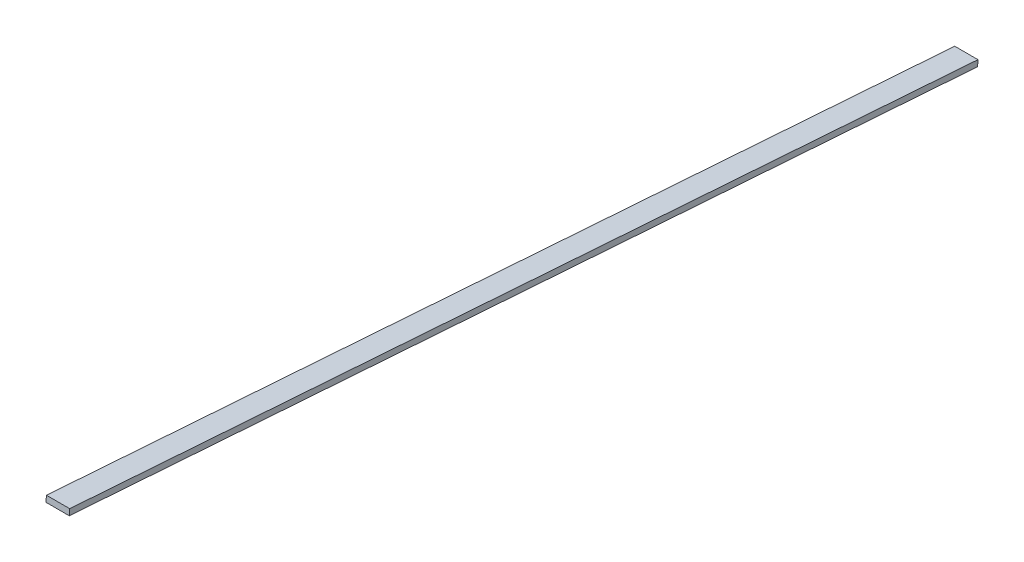
ISO-10303-21;
HEADER;
FILE_DESCRIPTION(('STEP AP214'),'2;1');
FILE_NAME('part.step','',(''),(''),'','','');
FILE_SCHEMA(('AUTOMOTIVE_DESIGN { 1 0 10303 214 1 1 1 1 }'));
ENDSEC;
DATA;
#1=APPLICATION_CONTEXT('core data for automotive mechanical design processes');
#2=APPLICATION_PROTOCOL_DEFINITION('international standard','automotive_design',2000,#1);
#3=PRODUCT_CONTEXT('',#1,'mechanical');
#4=PRODUCT('Part','Part','',(#3));
#5=PRODUCT_RELATED_PRODUCT_CATEGORY('part','',(#4));
#6=PRODUCT_DEFINITION_FORMATION('','',#4);
#7=PRODUCT_DEFINITION_CONTEXT('part definition',#1,'design');
#8=PRODUCT_DEFINITION('design','',#6,#7);
#9=PRODUCT_DEFINITION_SHAPE('','',#8);
#10=(LENGTH_UNIT() NAMED_UNIT(*) SI_UNIT(.MILLI.,.METRE.));
#11=(NAMED_UNIT(*) PLANE_ANGLE_UNIT() SI_UNIT($,.RADIAN.));
#12=(NAMED_UNIT(*) SI_UNIT($,.STERADIAN.) SOLID_ANGLE_UNIT());
#13=UNCERTAINTY_MEASURE_WITH_UNIT(LENGTH_MEASURE(1.E-05),#10,'distance_accuracy_value','');
#14=(GEOMETRIC_REPRESENTATION_CONTEXT(3) GLOBAL_UNCERTAINTY_ASSIGNED_CONTEXT((#13)) GLOBAL_UNIT_ASSIGNED_CONTEXT((#10,
#11,#12)) REPRESENTATION_CONTEXT('',''));
#15=CARTESIAN_POINT('',(0.,0.,0.));
#16=DIRECTION('',(0.,0.,1.));
#17=DIRECTION('',(1.,0.,0.));
#18=AXIS2_PLACEMENT_3D('',#15,#16,#17);
#19=CARTESIAN_POINT('',(238.509206630726,-2.28315338320972E-13,-3.17570620364431E-12));
#20=DIRECTION('',(-1.,0.,0.));
#21=DIRECTION('',(0.,0.,-1.));
#22=AXIS2_PLACEMENT_3D('',#19,#20,#21);
#23=PLANE('',#22);
#24=DIRECTION('',(0.,0.997425576822391,-0.0717092650953869));
#25=VECTOR('',#24,1.);
#26=CARTESIAN_POINT('',(238.509206630716,424.560737078755,-777.222709452929));
#27=LINE('',#26,#25);
#28=CARTESIAN_POINT('',(238.509206630716,419.810497769102,-776.88119407791));
#29=VERTEX_POINT('',#28);
#30=CARTESIAN_POINT('',(238.509206630716,424.560737078755,-777.222709452929));
#31=VERTEX_POINT('',#30);
#32=EDGE_CURVE('E88',#29,#31,#27,.T.);
#33=ORIENTED_EDGE('',*,*,#32,.T.);
#34=DIRECTION('',(0.,-0.0717092650953896,-0.997425576822391));
#35=VECTOR('',#34,1.);
#36=CARTESIAN_POINT('',(238.509206630707,372.516415969676,-1501.12270945293));
#37=LINE('',#36,#35);
#38=CARTESIAN_POINT('',(238.509206630707,372.516415969676,-1501.12270945293));
#39=VERTEX_POINT('',#38);
#40=EDGE_CURVE('E94',#31,#39,#37,.T.);
#41=ORIENTED_EDGE('',*,*,#40,.T.);
#42=DIRECTION('',(0.,-0.997425576822391,0.0717092650953928));
#43=VECTOR('',#42,1.);
#44=CARTESIAN_POINT('',(238.509206630707,367.766176660059,-1500.78119407791));
#45=LINE('',#44,#43);
#46=CARTESIAN_POINT('',(238.509206630707,367.766176660059,-1500.78119407791));
#47=VERTEX_POINT('',#46);
#48=EDGE_CURVE('E90',#39,#47,#45,.T.);
#49=ORIENTED_EDGE('',*,*,#48,.T.);
#50=DIRECTION('',(0.,0.0717092650953895,0.997425576822391));
#51=VECTOR('',#50,1.);
#52=CARTESIAN_POINT('',(238.509206630707,367.994441226327,-1497.60619407791));
#53=LINE('',#52,#51);
#54=EDGE_CURVE('E80',#47,#29,#53,.T.);
#55=ORIENTED_EDGE('',*,*,#54,.T.);
#56=EDGE_LOOP('',(#33,#41,#49,#55));
#57=FACE_BOUND('',#56,.T.);
#58=ADVANCED_FACE('F35',(#57),#23,.T.);
#59=CARTESIAN_POINT('',(983.516205571364,367.994441226327,-1497.60619407792));
#60=DIRECTION('',(0.,0.997425576822391,-0.0717092650953895));
#61=DIRECTION('',(0.,-0.0717092650953895,-0.997425576822391));
#62=AXIS2_PLACEMENT_3D('',#59,#60,#61);
#63=PLANE('',#62);
#64=DIRECTION('',(-1.,0.,0.));
#65=VECTOR('',#64,1.);
#66=CARTESIAN_POINT('',(983.516205571374,419.810497769102,-776.88119407792));
#67=LINE('',#66,#65);
#68=CARTESIAN_POINT('',(257.051206630713,419.810497769138,-776.88119407791));
#69=VERTEX_POINT('',#68);
#70=EDGE_CURVE('E76',#69,#29,#67,.T.);
#71=ORIENTED_EDGE('',*,*,#70,.T.);
#72=ORIENTED_EDGE('',*,*,#54,.F.);
#73=DIRECTION('',(-1.,0.,0.));
#74=VECTOR('',#73,1.);
#75=CARTESIAN_POINT('',(983.516205571364,367.766176660059,-1500.78119407792));
#76=LINE('',#75,#74);
#77=CARTESIAN_POINT('',(257.051206630709,367.766176660059,-1500.78119407791));
#78=VERTEX_POINT('',#77);
#79=EDGE_CURVE('E91',#78,#47,#76,.T.);
#80=ORIENTED_EDGE('',*,*,#79,.F.);
#81=DIRECTION('',(0.,-0.0717092650953895,-0.997425576822391));
#82=VECTOR('',#81,1.);
#83=CARTESIAN_POINT('',(257.051206630704,367.994441226327,-1497.60619407791));
#84=LINE('',#83,#82);
#85=EDGE_CURVE('E39',#69,#78,#84,.T.);
#86=ORIENTED_EDGE('',*,*,#85,.F.);
#87=EDGE_LOOP('',(#71,#72,#80,#86));
#88=FACE_BOUND('',#87,.T.);
#89=ADVANCED_FACE('F78',(#88),#63,.F.);
#90=CARTESIAN_POINT('',(983.516205571364,367.766176660059,-1500.78119407792));
#91=DIRECTION('',(0.,0.0717092650953929,0.997425576822391));
#92=DIRECTION('',(0.,0.997425576822391,-0.0717092650953929));
#93=AXIS2_PLACEMENT_3D('',#90,#91,#92);
#94=PLANE('',#93);
#95=ORIENTED_EDGE('',*,*,#79,.T.);
#96=ORIENTED_EDGE('',*,*,#48,.F.);
#97=DIRECTION('',(-1.,0.,0.));
#98=VECTOR('',#97,1.);
#99=CARTESIAN_POINT('',(983.516205571364,372.516415969676,-1501.12270945294));
#100=LINE('',#99,#98);
#101=CARTESIAN_POINT('',(257.051206630704,372.516415969676,-1501.12270945293));
#102=VERTEX_POINT('',#101);
#103=EDGE_CURVE('E101',#102,#39,#100,.T.);
#104=ORIENTED_EDGE('',*,*,#103,.F.);
#105=DIRECTION('',(0.,0.997425576822391,-0.0717092650953929));
#106=VECTOR('',#105,1.);
#107=CARTESIAN_POINT('',(257.051206630704,367.766176660059,-1500.78119407791));
#108=LINE('',#107,#106);
#109=EDGE_CURVE('E107',#78,#102,#108,.T.);
#110=ORIENTED_EDGE('',*,*,#109,.F.);
#111=EDGE_LOOP('',(#95,#96,#104,#110));
#112=FACE_BOUND('',#111,.T.);
#113=ADVANCED_FACE('F106',(#112),#94,.F.);
#114=CARTESIAN_POINT('',(983.516205571364,372.516415969676,-1501.12270945294));
#115=DIRECTION('',(0.,-0.997425576822391,0.0717092650953896));
#116=DIRECTION('',(0.,0.0717092650953896,0.997425576822391));
#117=AXIS2_PLACEMENT_3D('',#114,#115,#116);
#118=PLANE('',#117);
#119=ORIENTED_EDGE('',*,*,#103,.T.);
#120=ORIENTED_EDGE('',*,*,#40,.F.);
#121=DIRECTION('',(-1.,0.,0.));
#122=VECTOR('',#121,1.);
#123=CARTESIAN_POINT('',(983.516205571374,424.560737078755,-777.222709452939));
#124=LINE('',#123,#122);
#125=CARTESIAN_POINT('',(257.051206630713,424.560737078755,-777.222709452929));
#126=VERTEX_POINT('',#125);
#127=EDGE_CURVE('E84',#126,#31,#124,.T.);
#128=ORIENTED_EDGE('',*,*,#127,.F.);
#129=DIRECTION('',(0.,0.0717092650953896,0.997425576822391));
#130=VECTOR('',#129,1.);
#131=CARTESIAN_POINT('',(257.051206630704,372.516415969676,-1501.12270945293));
#132=LINE('',#131,#130);
#133=EDGE_CURVE('E44',#102,#126,#132,.T.);
#134=ORIENTED_EDGE('',*,*,#133,.F.);
#135=EDGE_LOOP('',(#119,#120,#128,#134));
#136=FACE_BOUND('',#135,.T.);
#137=ADVANCED_FACE('F104',(#136),#118,.F.);
#138=CARTESIAN_POINT('',(983.516205571374,424.560737078755,-777.222709452939));
#139=DIRECTION('',(0.,-0.0717092650953869,-0.997425576822391));
#140=DIRECTION('',(0.,-0.997425576822391,0.0717092650953869));
#141=AXIS2_PLACEMENT_3D('',#138,#139,#140);
#142=PLANE('',#141);
#143=ORIENTED_EDGE('',*,*,#127,.T.);
#144=ORIENTED_EDGE('',*,*,#32,.F.);
#145=ORIENTED_EDGE('',*,*,#70,.F.);
#146=DIRECTION('',(0.,-0.997425576822391,0.0717092650953869));
#147=VECTOR('',#146,1.);
#148=CARTESIAN_POINT('',(257.051206630713,424.560737078755,-777.222709452929));
#149=LINE('',#148,#147);
#150=EDGE_CURVE('E11',#126,#69,#149,.T.);
#151=ORIENTED_EDGE('',*,*,#150,.F.);
#152=EDGE_LOOP('',(#143,#144,#145,#151));
#153=FACE_BOUND('',#152,.T.);
#154=ADVANCED_FACE('F37',(#153),#142,.F.);
#155=CARTESIAN_POINT('',(257.051206630713,344.834338896103,-776.881194077912));
#156=DIRECTION('',(-1.,0.,0.));
#157=DIRECTION('',(0.,0.,-1.));
#158=AXIS2_PLACEMENT_3D('',#155,#156,#157);
#159=PLANE('',#158);
#160=ORIENTED_EDGE('',*,*,#133,.T.);
#161=ORIENTED_EDGE('',*,*,#150,.T.);
#162=ORIENTED_EDGE('',*,*,#85,.T.);
#163=ORIENTED_EDGE('',*,*,#109,.T.);
#164=EDGE_LOOP('',(#160,#161,#162,#163));
#165=FACE_BOUND('',#164,.T.);
#166=ADVANCED_FACE('F109',(#165),#159,.F.);
#167=CLOSED_SHELL('',(#58,#89,#113,#137,#154,#166));
#168=MANIFOLD_SOLID_BREP('B2',#167);
#169=ADVANCED_BREP_SHAPE_REPRESENTATION('',(#18,#168),#14);
#170=SHAPE_DEFINITION_REPRESENTATION(#9,#169);
ENDSEC;
END-ISO-10303-21;
